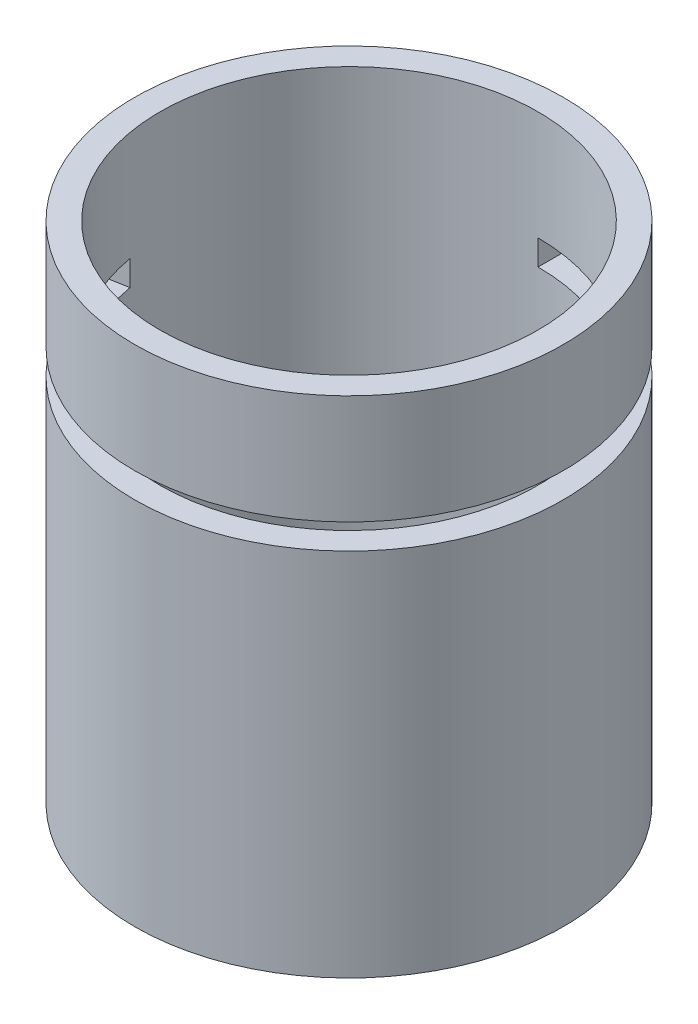
ISO-10303-21;
HEADER;
FILE_DESCRIPTION(('STEP AP214'),'2;1');
FILE_NAME('part.step','',(''),(''),'','','');
FILE_SCHEMA(('AUTOMOTIVE_DESIGN { 1 0 10303 214 1 1 1 1 }'));
ENDSEC;
DATA;
#1=APPLICATION_CONTEXT('core data for automotive mechanical design processes');
#2=APPLICATION_PROTOCOL_DEFINITION('international standard','automotive_design',2000,#1);
#3=PRODUCT_CONTEXT('',#1,'mechanical');
#4=PRODUCT('Part','Part','',(#3));
#5=PRODUCT_RELATED_PRODUCT_CATEGORY('part','',(#4));
#6=PRODUCT_DEFINITION_FORMATION('','',#4);
#7=PRODUCT_DEFINITION_CONTEXT('part definition',#1,'design');
#8=PRODUCT_DEFINITION('design','',#6,#7);
#9=PRODUCT_DEFINITION_SHAPE('','',#8);
#10=(LENGTH_UNIT() NAMED_UNIT(*) SI_UNIT(.MILLI.,.METRE.));
#11=(NAMED_UNIT(*) PLANE_ANGLE_UNIT() SI_UNIT($,.RADIAN.));
#12=(NAMED_UNIT(*) SI_UNIT($,.STERADIAN.) SOLID_ANGLE_UNIT());
#13=UNCERTAINTY_MEASURE_WITH_UNIT(LENGTH_MEASURE(1.E-05),#10,'distance_accuracy_value','');
#14=(GEOMETRIC_REPRESENTATION_CONTEXT(3) GLOBAL_UNCERTAINTY_ASSIGNED_CONTEXT((#13)) GLOBAL_UNIT_ASSIGNED_CONTEXT((#10,
#11,#12)) REPRESENTATION_CONTEXT('',''));
#15=CARTESIAN_POINT('',(0.,0.,0.));
#16=DIRECTION('',(0.,0.,1.));
#17=DIRECTION('',(1.,0.,0.));
#18=AXIS2_PLACEMENT_3D('',#15,#16,#17);
#19=CARTESIAN_POINT('',(0.,60.,0.));
#20=DIRECTION('',(0.,-1.,0.));
#21=DIRECTION('',(0.,0.,-1.));
#22=AXIS2_PLACEMENT_3D('',#19,#20,#21);
#23=CYLINDRICAL_SURFACE('',#22,25.5);
#24=CARTESIAN_POINT('',(0.,0.,0.));
#25=DIRECTION('',(0.,1.,0.));
#26=DIRECTION('',(0.,0.,1.));
#27=AXIS2_PLACEMENT_3D('',#24,#25,#26);
#28=CIRCLE('',#27,25.5);
#29=CARTESIAN_POINT('',(0.,0.,25.5));
#30=VERTEX_POINT('',#29);
#31=EDGE_CURVE('E99',#30,#30,#28,.T.);
#32=ORIENTED_EDGE('',*,*,#31,.T.);
#33=EDGE_LOOP('',(#32));
#34=FACE_BOUND('',#33,.T.);
#35=CARTESIAN_POINT('',(0.,60.,0.));
#36=DIRECTION('',(0.,1.,0.));
#37=DIRECTION('',(0.,0.,1.));
#38=AXIS2_PLACEMENT_3D('',#35,#36,#37);
#39=CIRCLE('',#38,25.5);
#40=CARTESIAN_POINT('',(0.,60.,25.5));
#41=VERTEX_POINT('',#40);
#42=EDGE_CURVE('E101',#41,#41,#39,.T.);
#43=ORIENTED_EDGE('',*,*,#42,.F.);
#44=EDGE_LOOP('',(#43));
#45=FACE_BOUND('',#44,.T.);
#46=DIRECTION('',(0.,-1.,0.));
#47=VECTOR('',#46,1.);
#48=CARTESIAN_POINT('',(-25.1125977018113,60.,4.42802853050648));
#49=LINE('',#48,#47);
#50=CARTESIAN_POINT('',(-25.1125977018114,47.,4.42802853050648));
#51=VERTEX_POINT('',#50);
#52=CARTESIAN_POINT('',(-25.1125977018114,44.,4.42802853050648));
#53=VERTEX_POINT('',#52);
#54=EDGE_CURVE('E76',#51,#53,#49,.T.);
#55=ORIENTED_EDGE('',*,*,#54,.F.);
#56=CARTESIAN_POINT('',(0.,47.,0.));
#57=DIRECTION('',(0.,-1.,0.));
#58=DIRECTION('',(0.,0.,-1.));
#59=AXIS2_PLACEMENT_3D('',#56,#57,#58);
#60=CIRCLE('',#59,25.5);
#61=CARTESIAN_POINT('',(0.,47.,-25.5));
#62=VERTEX_POINT('',#61);
#63=EDGE_CURVE('E82',#62,#51,#60,.T.);
#64=ORIENTED_EDGE('',*,*,#63,.F.);
#65=DIRECTION('',(0.,-1.,0.));
#66=VECTOR('',#65,1.);
#67=CARTESIAN_POINT('',(0.,60.,-25.5));
#68=LINE('',#67,#66);
#69=CARTESIAN_POINT('',(0.,44.,-25.5));
#70=VERTEX_POINT('',#69);
#71=EDGE_CURVE('E71',#62,#70,#68,.T.);
#72=ORIENTED_EDGE('',*,*,#71,.T.);
#73=CARTESIAN_POINT('',(0.,44.,0.));
#74=DIRECTION('',(0.,1.,0.));
#75=DIRECTION('',(0.,0.,1.));
#76=AXIS2_PLACEMENT_3D('',#73,#74,#75);
#77=CIRCLE('',#76,25.5);
#78=EDGE_CURVE('E90',#53,#70,#77,.T.);
#79=ORIENTED_EDGE('',*,*,#78,.F.);
#80=EDGE_LOOP('',(#55,#64,#72,#79));
#81=FACE_BOUND('',#80,.T.);
#82=ADVANCED_FACE('F34',(#34,#45,#81),#23,.T.);
#83=CARTESIAN_POINT('',(0.,60.,0.));
#84=DIRECTION('',(0.,-1.,0.));
#85=DIRECTION('',(0.,0.,-1.));
#86=AXIS2_PLACEMENT_3D('',#83,#84,#85);
#87=CYLINDRICAL_SURFACE('',#86,22.5);
#88=CARTESIAN_POINT('',(0.,60.,0.));
#89=DIRECTION('',(0.,1.,0.));
#90=DIRECTION('',(0.,0.,1.));
#91=AXIS2_PLACEMENT_3D('',#88,#89,#90);
#92=CIRCLE('',#91,22.5);
#93=CARTESIAN_POINT('',(0.,60.,22.5));
#94=VERTEX_POINT('',#93);
#95=EDGE_CURVE('E93',#94,#94,#92,.T.);
#96=ORIENTED_EDGE('',*,*,#95,.T.);
#97=EDGE_LOOP('',(#96));
#98=FACE_BOUND('',#97,.T.);
#99=CARTESIAN_POINT('',(0.,0.,0.));
#100=DIRECTION('',(0.,1.,0.));
#101=DIRECTION('',(0.,0.,1.));
#102=AXIS2_PLACEMENT_3D('',#99,#100,#101);
#103=CIRCLE('',#102,22.5);
#104=CARTESIAN_POINT('',(0.,0.,22.5));
#105=VERTEX_POINT('',#104);
#106=EDGE_CURVE('E89',#105,#105,#103,.T.);
#107=ORIENTED_EDGE('',*,*,#106,.F.);
#108=EDGE_LOOP('',(#107));
#109=FACE_BOUND('',#108,.T.);
#110=CARTESIAN_POINT('',(0.,47.,0.));
#111=DIRECTION('',(0.,-1.,0.));
#112=DIRECTION('',(0.,0.,-1.));
#113=AXIS2_PLACEMENT_3D('',#110,#111,#112);
#114=CIRCLE('',#113,22.5);
#115=CARTESIAN_POINT('',(0.,47.,-22.5));
#116=VERTEX_POINT('',#115);
#117=CARTESIAN_POINT('',(-22.1581744427747,47.,3.90708399750572));
#118=VERTEX_POINT('',#117);
#119=EDGE_CURVE('E41',#116,#118,#114,.T.);
#120=ORIENTED_EDGE('',*,*,#119,.T.);
#121=DIRECTION('',(0.,-1.,0.));
#122=VECTOR('',#121,1.);
#123=CARTESIAN_POINT('',(-22.1581744427747,60.,3.90708399750571));
#124=LINE('',#123,#122);
#125=CARTESIAN_POINT('',(-22.1581744427747,44.,3.90708399750572));
#126=VERTEX_POINT('',#125);
#127=EDGE_CURVE('E11',#118,#126,#124,.T.);
#128=ORIENTED_EDGE('',*,*,#127,.T.);
#129=CARTESIAN_POINT('',(0.,44.,0.));
#130=DIRECTION('',(0.,1.,0.));
#131=DIRECTION('',(0.,0.,1.));
#132=AXIS2_PLACEMENT_3D('',#129,#130,#131);
#133=CIRCLE('',#132,22.5);
#134=CARTESIAN_POINT('',(0.,44.,-22.5));
#135=VERTEX_POINT('',#134);
#136=EDGE_CURVE('E108',#126,#135,#133,.T.);
#137=ORIENTED_EDGE('',*,*,#136,.T.);
#138=DIRECTION('',(0.,-1.,0.));
#139=VECTOR('',#138,1.);
#140=CARTESIAN_POINT('',(0.,60.,-22.5));
#141=LINE('',#140,#139);
#142=EDGE_CURVE('E104',#116,#135,#141,.T.);
#143=ORIENTED_EDGE('',*,*,#142,.F.);
#144=EDGE_LOOP('',(#120,#128,#137,#143));
#145=FACE_BOUND('',#144,.T.);
#146=ADVANCED_FACE('F111',(#98,#109,#145),#87,.F.);
#147=CARTESIAN_POINT('',(0.,60.,0.));
#148=DIRECTION('',(0.,1.,0.));
#149=DIRECTION('',(0.,0.,1.));
#150=AXIS2_PLACEMENT_3D('',#147,#148,#149);
#151=PLANE('',#150);
#152=ORIENTED_EDGE('',*,*,#42,.T.);
#153=EDGE_LOOP('',(#152));
#154=FACE_BOUND('',#153,.T.);
#155=ORIENTED_EDGE('',*,*,#95,.F.);
#156=EDGE_LOOP('',(#155));
#157=FACE_BOUND('',#156,.T.);
#158=ADVANCED_FACE('F134',(#154,#157),#151,.T.);
#159=CARTESIAN_POINT('',(0.,0.,0.));
#160=DIRECTION('',(0.,1.,0.));
#161=DIRECTION('',(0.,0.,1.));
#162=AXIS2_PLACEMENT_3D('',#159,#160,#161);
#163=PLANE('',#162);
#164=ORIENTED_EDGE('',*,*,#31,.F.);
#165=EDGE_LOOP('',(#164));
#166=FACE_BOUND('',#165,.T.);
#167=ORIENTED_EDGE('',*,*,#106,.T.);
#168=EDGE_LOOP('',(#167));
#169=FACE_BOUND('',#168,.T.);
#170=ADVANCED_FACE('F143',(#166,#169),#163,.F.);
#171=CARTESIAN_POINT('',(0.,47.,0.));
#172=DIRECTION('',(0.,-1.,0.));
#173=DIRECTION('',(0.,0.,-1.));
#174=AXIS2_PLACEMENT_3D('',#171,#172,#173);
#175=PLANE('',#174);
#176=ORIENTED_EDGE('',*,*,#63,.T.);
#177=DIRECTION('',(0.98480775301221,0.,-0.173648177666921));
#178=VECTOR('',#177,1.);
#179=CARTESIAN_POINT('',(0.,47.,0.));
#180=LINE('',#179,#178);
#181=EDGE_CURVE('E77',#51,#118,#180,.T.);
#182=ORIENTED_EDGE('',*,*,#181,.T.);
#183=ORIENTED_EDGE('',*,*,#119,.F.);
#184=DIRECTION('',(0.,0.,1.));
#185=VECTOR('',#184,1.);
#186=CARTESIAN_POINT('',(0.,47.,0.));
#187=LINE('',#186,#185);
#188=EDGE_CURVE('E53',#62,#116,#187,.T.);
#189=ORIENTED_EDGE('',*,*,#188,.F.);
#190=EDGE_LOOP('',(#176,#182,#183,#189));
#191=FACE_BOUND('',#190,.T.);
#192=ADVANCED_FACE('F80',(#191),#175,.T.);
#193=CARTESIAN_POINT('',(0.,44.,0.));
#194=DIRECTION('',(0.,1.,0.));
#195=DIRECTION('',(0.,0.,1.));
#196=AXIS2_PLACEMENT_3D('',#193,#194,#195);
#197=PLANE('',#196);
#198=ORIENTED_EDGE('',*,*,#78,.T.);
#199=DIRECTION('',(0.,0.,-1.));
#200=VECTOR('',#199,1.);
#201=CARTESIAN_POINT('',(0.,44.,0.));
#202=LINE('',#201,#200);
#203=EDGE_CURVE('E48',#135,#70,#202,.T.);
#204=ORIENTED_EDGE('',*,*,#203,.F.);
#205=ORIENTED_EDGE('',*,*,#136,.F.);
#206=DIRECTION('',(-0.98480775301221,0.,0.173648177666921));
#207=VECTOR('',#206,1.);
#208=CARTESIAN_POINT('',(0.,44.,0.));
#209=LINE('',#208,#207);
#210=EDGE_CURVE('E86',#126,#53,#209,.T.);
#211=ORIENTED_EDGE('',*,*,#210,.T.);
#212=EDGE_LOOP('',(#198,#204,#205,#211));
#213=FACE_BOUND('',#212,.T.);
#214=ADVANCED_FACE('F113',(#213),#197,.T.);
#215=CARTESIAN_POINT('',(0.,0.,0.));
#216=DIRECTION('',(0.173648177666921,0.,0.98480775301221));
#217=DIRECTION('',(0.98480775301221,0.,-0.173648177666921));
#218=AXIS2_PLACEMENT_3D('',#215,#216,#217);
#219=PLANE('',#218);
#220=ORIENTED_EDGE('',*,*,#54,.T.);
#221=ORIENTED_EDGE('',*,*,#210,.F.);
#222=ORIENTED_EDGE('',*,*,#127,.F.);
#223=ORIENTED_EDGE('',*,*,#181,.F.);
#224=EDGE_LOOP('',(#220,#221,#222,#223));
#225=FACE_BOUND('',#224,.T.);
#226=ADVANCED_FACE('F120',(#225),#219,.T.);
#227=CARTESIAN_POINT('',(0.,0.,0.));
#228=DIRECTION('',(-1.,0.,0.));
#229=DIRECTION('',(0.,0.,1.));
#230=AXIS2_PLACEMENT_3D('',#227,#228,#229);
#231=PLANE('',#230);
#232=ORIENTED_EDGE('',*,*,#188,.T.);
#233=ORIENTED_EDGE('',*,*,#142,.T.);
#234=ORIENTED_EDGE('',*,*,#203,.T.);
#235=ORIENTED_EDGE('',*,*,#71,.F.);
#236=EDGE_LOOP('',(#232,#233,#234,#235));
#237=FACE_BOUND('',#236,.T.);
#238=ADVANCED_FACE('F72',(#237),#231,.F.);
#239=CLOSED_SHELL('',(#82,#146,#158,#170,#192,#214,#226,#238));
#240=MANIFOLD_SOLID_BREP('B2',#239);
#241=ADVANCED_BREP_SHAPE_REPRESENTATION('',(#18,#240),#14);
#242=SHAPE_DEFINITION_REPRESENTATION(#9,#241);
ENDSEC;
END-ISO-10303-21;
